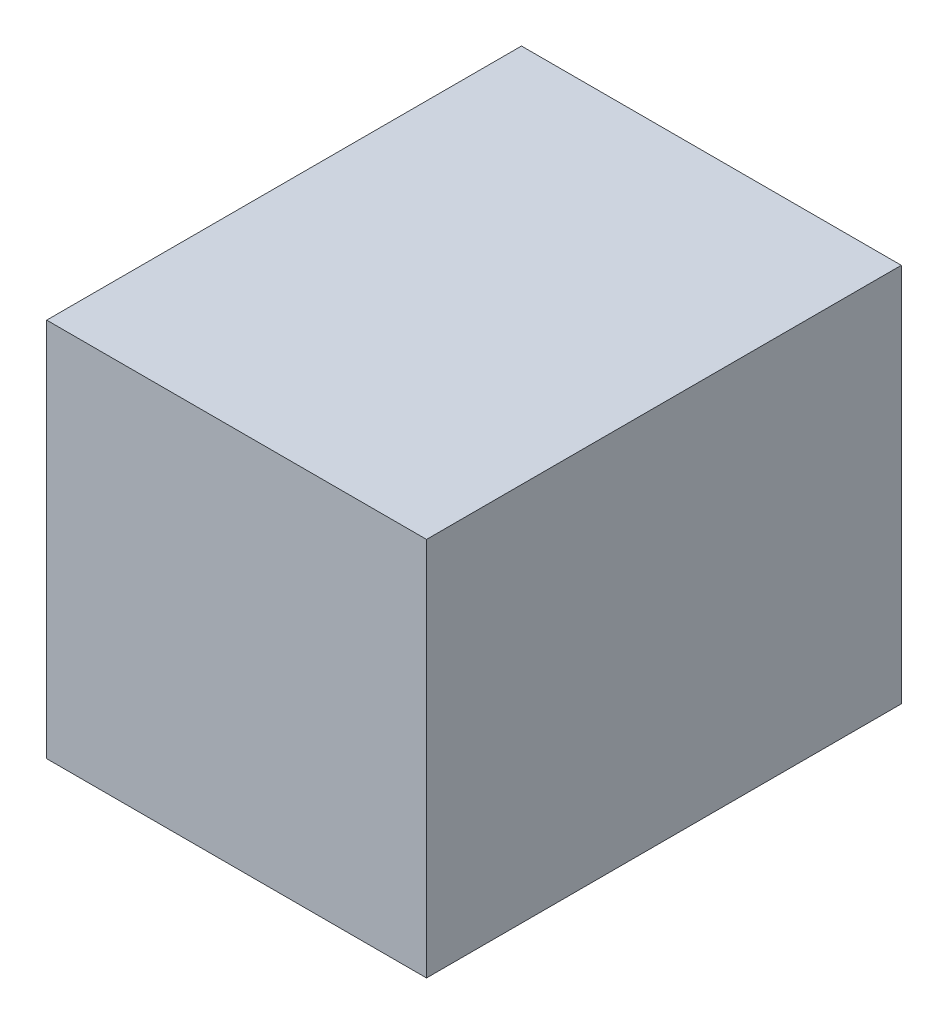
ISO-10303-21;
HEADER;
FILE_DESCRIPTION(('STEP AP214'),'2;1');
FILE_NAME('part.step','',(''),(''),'','','');
FILE_SCHEMA(('AUTOMOTIVE_DESIGN { 1 0 10303 214 1 1 1 1 }'));
ENDSEC;
DATA;
#1=APPLICATION_CONTEXT('core data for automotive mechanical design processes');
#2=APPLICATION_PROTOCOL_DEFINITION('international standard','automotive_design',2000,#1);
#3=PRODUCT_CONTEXT('',#1,'mechanical');
#4=PRODUCT('Part','Part','',(#3));
#5=PRODUCT_RELATED_PRODUCT_CATEGORY('part','',(#4));
#6=PRODUCT_DEFINITION_FORMATION('','',#4);
#7=PRODUCT_DEFINITION_CONTEXT('part definition',#1,'design');
#8=PRODUCT_DEFINITION('design','',#6,#7);
#9=PRODUCT_DEFINITION_SHAPE('','',#8);
#10=(LENGTH_UNIT() NAMED_UNIT(*) SI_UNIT(.MILLI.,.METRE.));
#11=(NAMED_UNIT(*) PLANE_ANGLE_UNIT() SI_UNIT($,.RADIAN.));
#12=(NAMED_UNIT(*) SI_UNIT($,.STERADIAN.) SOLID_ANGLE_UNIT());
#13=UNCERTAINTY_MEASURE_WITH_UNIT(LENGTH_MEASURE(1.E-05),#10,'distance_accuracy_value','');
#14=(GEOMETRIC_REPRESENTATION_CONTEXT(3) GLOBAL_UNCERTAINTY_ASSIGNED_CONTEXT((#13)) GLOBAL_UNIT_ASSIGNED_CONTEXT((#10,
#11,#12)) REPRESENTATION_CONTEXT('',''));
#15=CARTESIAN_POINT('',(0.,0.,0.));
#16=DIRECTION('',(0.,0.,1.));
#17=DIRECTION('',(1.,0.,0.));
#18=AXIS2_PLACEMENT_3D('',#15,#16,#17);
#19=CARTESIAN_POINT('',(0.,0.,10.));
#20=DIRECTION('',(1.,0.,0.));
#21=DIRECTION('',(0.,0.,-1.));
#22=AXIS2_PLACEMENT_3D('',#19,#20,#21);
#23=PLANE('',#22);
#24=DIRECTION('',(0.,-1.,0.));
#25=VECTOR('',#24,1.);
#26=CARTESIAN_POINT('',(0.,0.,0.));
#27=LINE('',#26,#25);
#28=CARTESIAN_POINT('',(0.,8.,0.));
#29=VERTEX_POINT('',#28);
#30=CARTESIAN_POINT('',(0.,0.,0.));
#31=VERTEX_POINT('',#30);
#32=EDGE_CURVE('E99',#29,#31,#27,.T.);
#33=ORIENTED_EDGE('',*,*,#32,.T.);
#34=DIRECTION('',(0.,0.,-1.));
#35=VECTOR('',#34,1.);
#36=CARTESIAN_POINT('',(0.,0.,10.));
#37=LINE('',#36,#35);
#38=CARTESIAN_POINT('',(0.,0.,10.));
#39=VERTEX_POINT('',#38);
#40=EDGE_CURVE('E11',#39,#31,#37,.T.);
#41=ORIENTED_EDGE('',*,*,#40,.F.);
#42=DIRECTION('',(0.,-1.,0.));
#43=VECTOR('',#42,1.);
#44=CARTESIAN_POINT('',(0.,0.,10.));
#45=LINE('',#44,#43);
#46=CARTESIAN_POINT('',(0.,8.,10.));
#47=VERTEX_POINT('',#46);
#48=EDGE_CURVE('E87',#47,#39,#45,.T.);
#49=ORIENTED_EDGE('',*,*,#48,.F.);
#50=DIRECTION('',(0.,0.,-1.));
#51=VECTOR('',#50,1.);
#52=CARTESIAN_POINT('',(0.,8.,10.));
#53=LINE('',#52,#51);
#54=EDGE_CURVE('E95',#47,#29,#53,.T.);
#55=ORIENTED_EDGE('',*,*,#54,.T.);
#56=EDGE_LOOP('',(#33,#41,#49,#55));
#57=FACE_BOUND('',#56,.T.);
#58=ADVANCED_FACE('F36',(#57),#23,.F.);
#59=CARTESIAN_POINT('',(0.,0.,10.));
#60=DIRECTION('',(0.,1.,0.));
#61=DIRECTION('',(0.,0.,1.));
#62=AXIS2_PLACEMENT_3D('',#59,#60,#61);
#63=PLANE('',#62);
#64=DIRECTION('',(1.,0.,0.));
#65=VECTOR('',#64,1.);
#66=CARTESIAN_POINT('',(0.,0.,0.));
#67=LINE('',#66,#65);
#68=CARTESIAN_POINT('',(8.,0.,0.));
#69=VERTEX_POINT('',#68);
#70=EDGE_CURVE('E91',#31,#69,#67,.T.);
#71=ORIENTED_EDGE('',*,*,#70,.T.);
#72=DIRECTION('',(0.,0.,-1.));
#73=VECTOR('',#72,1.);
#74=CARTESIAN_POINT('',(8.,0.,10.));
#75=LINE('',#74,#73);
#76=CARTESIAN_POINT('',(8.,0.,10.));
#77=VERTEX_POINT('',#76);
#78=EDGE_CURVE('E44',#77,#69,#75,.T.);
#79=ORIENTED_EDGE('',*,*,#78,.F.);
#80=DIRECTION('',(1.,0.,0.));
#81=VECTOR('',#80,1.);
#82=CARTESIAN_POINT('',(0.,0.,10.));
#83=LINE('',#82,#81);
#84=EDGE_CURVE('E82',#39,#77,#83,.T.);
#85=ORIENTED_EDGE('',*,*,#84,.F.);
#86=ORIENTED_EDGE('',*,*,#40,.T.);
#87=EDGE_LOOP('',(#71,#79,#85,#86));
#88=FACE_BOUND('',#87,.T.);
#89=ADVANCED_FACE('F90',(#88),#63,.F.);
#90=CARTESIAN_POINT('',(8.,0.,10.));
#91=DIRECTION('',(-1.,0.,0.));
#92=DIRECTION('',(0.,-1.,0.));
#93=AXIS2_PLACEMENT_3D('',#90,#91,#92);
#94=PLANE('',#93);
#95=DIRECTION('',(0.,1.,0.));
#96=VECTOR('',#95,1.);
#97=CARTESIAN_POINT('',(8.,0.,0.));
#98=LINE('',#97,#96);
#99=CARTESIAN_POINT('',(8.,8.,0.));
#100=VERTEX_POINT('',#99);
#101=EDGE_CURVE('E69',#69,#100,#98,.T.);
#102=ORIENTED_EDGE('',*,*,#101,.T.);
#103=DIRECTION('',(0.,0.,-1.));
#104=VECTOR('',#103,1.);
#105=CARTESIAN_POINT('',(8.,8.,10.));
#106=LINE('',#105,#104);
#107=CARTESIAN_POINT('',(8.,8.,10.));
#108=VERTEX_POINT('',#107);
#109=EDGE_CURVE('E92',#108,#100,#106,.T.);
#110=ORIENTED_EDGE('',*,*,#109,.F.);
#111=DIRECTION('',(0.,1.,0.));
#112=VECTOR('',#111,1.);
#113=CARTESIAN_POINT('',(8.,0.,10.));
#114=LINE('',#113,#112);
#115=EDGE_CURVE('E85',#77,#108,#114,.T.);
#116=ORIENTED_EDGE('',*,*,#115,.F.);
#117=ORIENTED_EDGE('',*,*,#78,.T.);
#118=EDGE_LOOP('',(#102,#110,#116,#117));
#119=FACE_BOUND('',#118,.T.);
#120=ADVANCED_FACE('F93',(#119),#94,.F.);
#121=CARTESIAN_POINT('',(0.,8.,10.));
#122=DIRECTION('',(0.,-1.,0.));
#123=DIRECTION('',(0.,0.,-1.));
#124=AXIS2_PLACEMENT_3D('',#121,#122,#123);
#125=PLANE('',#124);
#126=DIRECTION('',(-1.,0.,0.));
#127=VECTOR('',#126,1.);
#128=CARTESIAN_POINT('',(0.,8.,0.));
#129=LINE('',#128,#127);
#130=EDGE_CURVE('E75',#100,#29,#129,.T.);
#131=ORIENTED_EDGE('',*,*,#130,.T.);
#132=ORIENTED_EDGE('',*,*,#54,.F.);
#133=DIRECTION('',(-1.,0.,0.));
#134=VECTOR('',#133,1.);
#135=CARTESIAN_POINT('',(0.,8.,10.));
#136=LINE('',#135,#134);
#137=EDGE_CURVE('E52',#108,#47,#136,.T.);
#138=ORIENTED_EDGE('',*,*,#137,.F.);
#139=ORIENTED_EDGE('',*,*,#109,.T.);
#140=EDGE_LOOP('',(#131,#132,#138,#139));
#141=FACE_BOUND('',#140,.T.);
#142=ADVANCED_FACE('F106',(#141),#125,.F.);
#143=CARTESIAN_POINT('',(0.,0.,10.));
#144=DIRECTION('',(0.,0.,-1.));
#145=DIRECTION('',(-1.,0.,0.));
#146=AXIS2_PLACEMENT_3D('',#143,#144,#145);
#147=PLANE('',#146);
#148=ORIENTED_EDGE('',*,*,#48,.T.);
#149=ORIENTED_EDGE('',*,*,#84,.T.);
#150=ORIENTED_EDGE('',*,*,#115,.T.);
#151=ORIENTED_EDGE('',*,*,#137,.T.);
#152=EDGE_LOOP('',(#148,#149,#150,#151));
#153=FACE_BOUND('',#152,.T.);
#154=ADVANCED_FACE('F83',(#153),#147,.F.);
#155=CARTESIAN_POINT('',(0.,0.,0.));
#156=DIRECTION('',(0.,0.,-1.));
#157=DIRECTION('',(-1.,0.,0.));
#158=AXIS2_PLACEMENT_3D('',#155,#156,#157);
#159=PLANE('',#158);
#160=ORIENTED_EDGE('',*,*,#32,.F.);
#161=ORIENTED_EDGE('',*,*,#130,.F.);
#162=ORIENTED_EDGE('',*,*,#101,.F.);
#163=ORIENTED_EDGE('',*,*,#70,.F.);
#164=EDGE_LOOP('',(#160,#161,#162,#163));
#165=FACE_BOUND('',#164,.T.);
#166=ADVANCED_FACE('F109',(#165),#159,.T.);
#167=CLOSED_SHELL('',(#58,#89,#120,#142,#154,#166));
#168=MANIFOLD_SOLID_BREP('B2',#167);
#169=ADVANCED_BREP_SHAPE_REPRESENTATION('',(#18,#168),#14);
#170=SHAPE_DEFINITION_REPRESENTATION(#9,#169);
ENDSEC;
END-ISO-10303-21;
